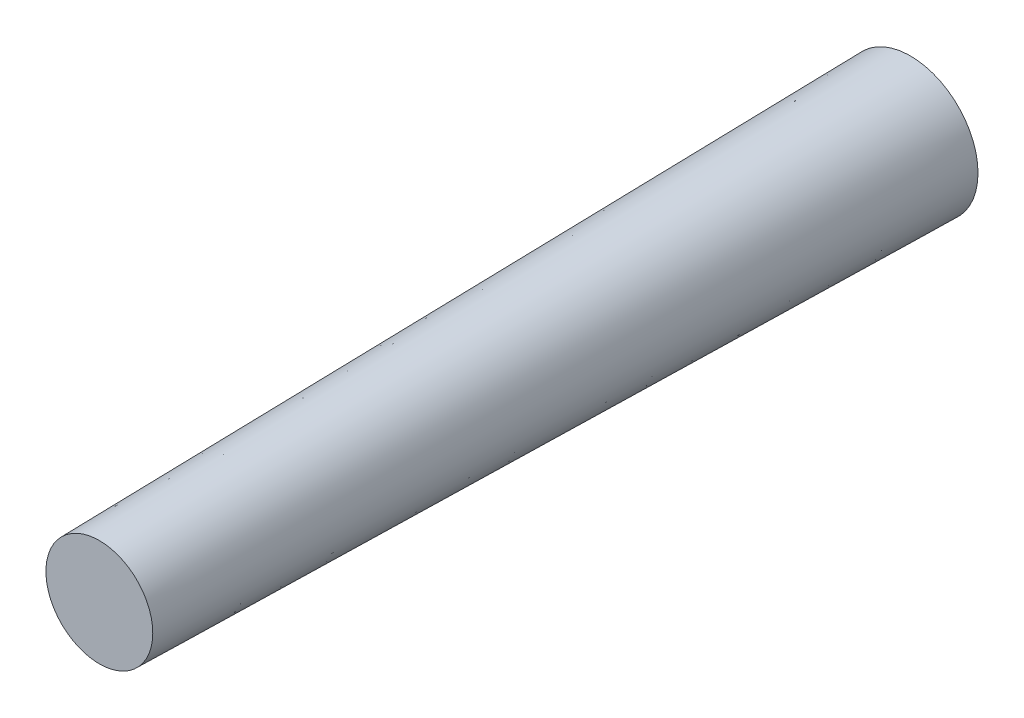
ISO-10303-21;
HEADER;
FILE_DESCRIPTION(('STEP AP214'),'2;1');
FILE_NAME('part.step','',(''),(''),'','','');
FILE_SCHEMA(('AUTOMOTIVE_DESIGN { 1 0 10303 214 1 1 1 1 }'));
ENDSEC;
DATA;
#1=APPLICATION_CONTEXT('core data for automotive mechanical design processes');
#2=APPLICATION_PROTOCOL_DEFINITION('international standard','automotive_design',2000,#1);
#3=PRODUCT_CONTEXT('',#1,'mechanical');
#4=PRODUCT('Part','Part','',(#3));
#5=PRODUCT_RELATED_PRODUCT_CATEGORY('part','',(#4));
#6=PRODUCT_DEFINITION_FORMATION('','',#4);
#7=PRODUCT_DEFINITION_CONTEXT('part definition',#1,'design');
#8=PRODUCT_DEFINITION('design','',#6,#7);
#9=PRODUCT_DEFINITION_SHAPE('','',#8);
#10=(LENGTH_UNIT() NAMED_UNIT(*) SI_UNIT(.MILLI.,.METRE.));
#11=(NAMED_UNIT(*) PLANE_ANGLE_UNIT() SI_UNIT($,.RADIAN.));
#12=(NAMED_UNIT(*) SI_UNIT($,.STERADIAN.) SOLID_ANGLE_UNIT());
#13=UNCERTAINTY_MEASURE_WITH_UNIT(LENGTH_MEASURE(1.E-05),#10,'distance_accuracy_value','');
#14=(GEOMETRIC_REPRESENTATION_CONTEXT(3) GLOBAL_UNCERTAINTY_ASSIGNED_CONTEXT((#13)) GLOBAL_UNIT_ASSIGNED_CONTEXT((#10,
#11,#12)) REPRESENTATION_CONTEXT('',''));
#15=CARTESIAN_POINT('',(0.,0.,0.));
#16=DIRECTION('',(0.,0.,1.));
#17=DIRECTION('',(1.,0.,0.));
#18=AXIS2_PLACEMENT_3D('',#15,#16,#17);
#19=CARTESIAN_POINT('',(0.,0.,0.));
#20=DIRECTION('',(0.,0.,-1.));
#21=DIRECTION('',(1.,0.,0.));
#22=AXIS2_PLACEMENT_3D('',#19,#20,#21);
#23=CONICAL_SURFACE('',#22,2.5,0.0174532925199433);
#24=CARTESIAN_POINT('',(0.,0.,30.));
#25=DIRECTION('',(0.,0.,1.));
#26=DIRECTION('',(1.,0.,0.));
#27=AXIS2_PLACEMENT_3D('',#24,#25,#26);
#28=CIRCLE('',#27,1.97634805215347);
#29=CARTESIAN_POINT('',(1.97634805215347,0.,30.));
#30=VERTEX_POINT('',#29);
#31=EDGE_CURVE('E10',#30,#30,#28,.T.);
#32=ORIENTED_EDGE('',*,*,#31,.F.);
#33=EDGE_LOOP('',(#32));
#34=FACE_BOUND('',#33,.T.);
#35=CARTESIAN_POINT('',(0.,0.,0.));
#36=DIRECTION('',(0.,0.,1.));
#37=DIRECTION('',(1.,0.,0.));
#38=AXIS2_PLACEMENT_3D('',#35,#36,#37);
#39=CIRCLE('',#38,2.5);
#40=CARTESIAN_POINT('',(2.5,0.,0.));
#41=VERTEX_POINT('',#40);
#42=EDGE_CURVE('E37',#41,#41,#39,.T.);
#43=ORIENTED_EDGE('',*,*,#42,.T.);
#44=EDGE_LOOP('',(#43));
#45=FACE_BOUND('',#44,.T.);
#46=ADVANCED_FACE('F31',(#34,#45),#23,.T.);
#47=CARTESIAN_POINT('',(0.,0.,30.));
#48=DIRECTION('',(0.,0.,1.));
#49=DIRECTION('',(1.,0.,0.));
#50=AXIS2_PLACEMENT_3D('',#47,#48,#49);
#51=PLANE('',#50);
#52=ORIENTED_EDGE('',*,*,#31,.T.);
#53=EDGE_LOOP('',(#52));
#54=FACE_BOUND('',#53,.T.);
#55=ADVANCED_FACE('F46',(#54),#51,.T.);
#56=CARTESIAN_POINT('',(0.,0.,0.));
#57=DIRECTION('',(0.,0.,1.));
#58=DIRECTION('',(1.,0.,0.));
#59=AXIS2_PLACEMENT_3D('',#56,#57,#58);
#60=PLANE('',#59);
#61=ORIENTED_EDGE('',*,*,#42,.F.);
#62=EDGE_LOOP('',(#61));
#63=FACE_BOUND('',#62,.T.);
#64=ADVANCED_FACE('F44',(#63),#60,.F.);
#65=CLOSED_SHELL('',(#46,#55,#64));
#66=MANIFOLD_SOLID_BREP('B2',#65);
#67=ADVANCED_BREP_SHAPE_REPRESENTATION('',(#18,#66),#14);
#68=SHAPE_DEFINITION_REPRESENTATION(#9,#67);
ENDSEC;
END-ISO-10303-21;
